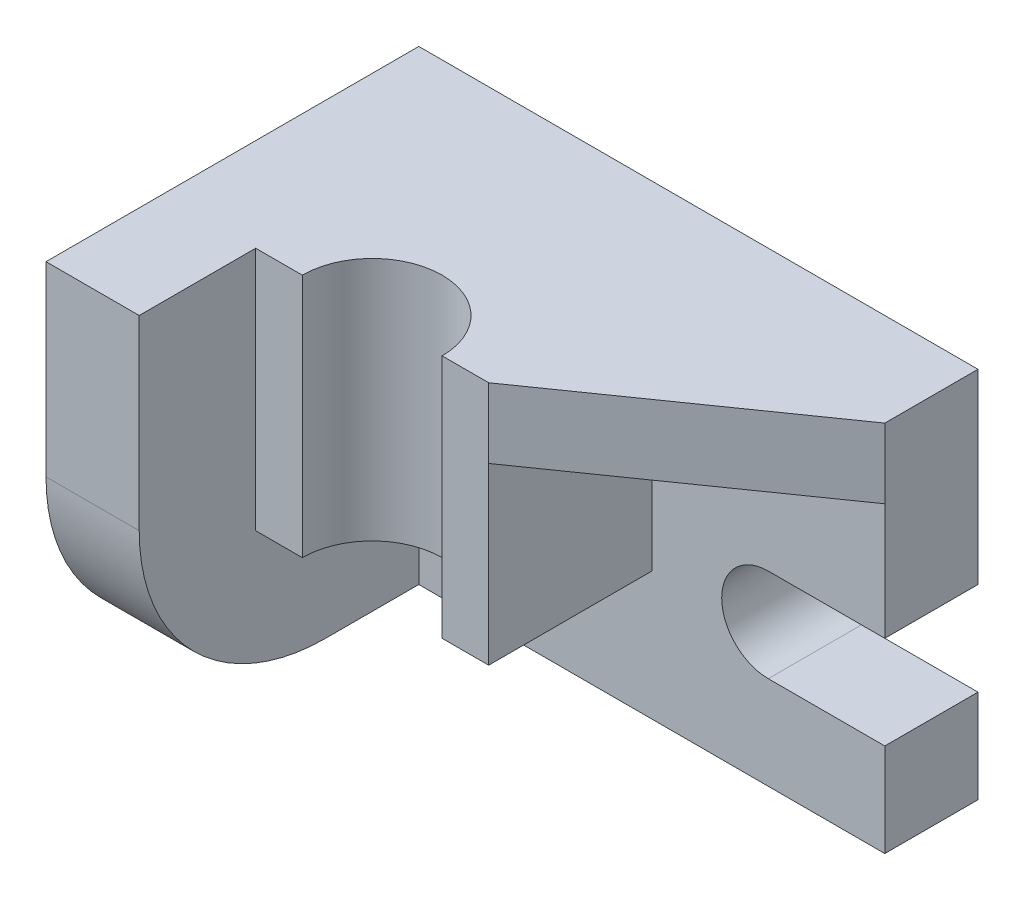
ISO-10303-21;
HEADER;
FILE_DESCRIPTION(('STEP AP214'),'2;1');
FILE_NAME('part.step','',(''),(''),'','','');
FILE_SCHEMA(('AUTOMOTIVE_DESIGN { 1 0 10303 214 1 1 1 1 }'));
ENDSEC;
DATA;
#1=APPLICATION_CONTEXT('core data for automotive mechanical design processes');
#2=APPLICATION_PROTOCOL_DEFINITION('international standard','automotive_design',2000,#1);
#3=PRODUCT_CONTEXT('',#1,'mechanical');
#4=PRODUCT('Part','Part','',(#3));
#5=PRODUCT_RELATED_PRODUCT_CATEGORY('part','',(#4));
#6=PRODUCT_DEFINITION_FORMATION('','',#4);
#7=PRODUCT_DEFINITION_CONTEXT('part definition',#1,'design');
#8=PRODUCT_DEFINITION('design','',#6,#7);
#9=PRODUCT_DEFINITION_SHAPE('','',#8);
#10=(LENGTH_UNIT() NAMED_UNIT(*) SI_UNIT(.MILLI.,.METRE.));
#11=(NAMED_UNIT(*) PLANE_ANGLE_UNIT() SI_UNIT($,.RADIAN.));
#12=(NAMED_UNIT(*) SI_UNIT($,.STERADIAN.) SOLID_ANGLE_UNIT());
#13=UNCERTAINTY_MEASURE_WITH_UNIT(LENGTH_MEASURE(1.E-05),#10,'distance_accuracy_value','');
#14=(GEOMETRIC_REPRESENTATION_CONTEXT(3) GLOBAL_UNCERTAINTY_ASSIGNED_CONTEXT((#13)) GLOBAL_UNIT_ASSIGNED_CONTEXT((#10,
#11,#12)) REPRESENTATION_CONTEXT('',''));
#15=CARTESIAN_POINT('',(0.,0.,0.));
#16=DIRECTION('',(0.,0.,1.));
#17=DIRECTION('',(1.,0.,0.));
#18=AXIS2_PLACEMENT_3D('',#15,#16,#17);
#19=CARTESIAN_POINT('',(96.,0.,16.));
#20=DIRECTION('',(-1.,0.,0.));
#21=DIRECTION('',(0.,0.,1.));
#22=AXIS2_PLACEMENT_3D('',#19,#20,#21);
#23=PLANE('',#22);
#24=DIRECTION('',(0.,1.,0.));
#25=VECTOR('',#24,1.);
#26=CARTESIAN_POINT('',(96.,0.,0.));
#27=LINE('',#26,#25);
#28=CARTESIAN_POINT('',(96.,0.,0.));
#29=VERTEX_POINT('',#28);
#30=CARTESIAN_POINT('',(96.,16.,0.));
#31=VERTEX_POINT('',#30);
#32=EDGE_CURVE('E172',#29,#31,#27,.T.);
#33=ORIENTED_EDGE('',*,*,#32,.T.);
#34=DIRECTION('',(0.,0.,1.));
#35=VECTOR('',#34,1.);
#36=CARTESIAN_POINT('',(96.,16.,0.));
#37=LINE('',#36,#35);
#38=CARTESIAN_POINT('',(96.,16.,16.));
#39=VERTEX_POINT('',#38);
#40=EDGE_CURVE('E157',#31,#39,#37,.T.);
#41=ORIENTED_EDGE('',*,*,#40,.T.);
#42=DIRECTION('',(0.,1.,0.));
#43=VECTOR('',#42,1.);
#44=CARTESIAN_POINT('',(96.,0.,16.));
#45=LINE('',#44,#43);
#46=CARTESIAN_POINT('',(96.,0.,16.));
#47=VERTEX_POINT('',#46);
#48=EDGE_CURVE('E192',#47,#39,#45,.T.);
#49=ORIENTED_EDGE('',*,*,#48,.F.);
#50=DIRECTION('',(0.,0.,-1.));
#51=VECTOR('',#50,1.);
#52=CARTESIAN_POINT('',(96.,0.,16.));
#53=LINE('',#52,#51);
#54=EDGE_CURVE('E45',#47,#29,#53,.T.);
#55=ORIENTED_EDGE('',*,*,#54,.T.);
#56=EDGE_LOOP('',(#33,#41,#49,#55));
#57=FACE_BOUND('',#56,.T.);
#58=ADVANCED_FACE('F37',(#57),#23,.F.);
#59=CARTESIAN_POINT('',(0.,0.,16.));
#60=DIRECTION('',(0.,0.,1.));
#61=DIRECTION('',(1.,0.,0.));
#62=AXIS2_PLACEMENT_3D('',#59,#60,#61);
#63=PLANE('',#62);
#64=DIRECTION('',(1.,0.,0.));
#65=VECTOR('',#64,1.);
#66=CARTESIAN_POINT('',(96.,16.,16.));
#67=LINE('',#66,#65);
#68=CARTESIAN_POINT('',(76.,16.,16.));
#69=VERTEX_POINT('',#68);
#70=EDGE_CURVE('E162',#69,#39,#67,.T.);
#71=ORIENTED_EDGE('',*,*,#70,.F.);
#72=CARTESIAN_POINT('',(76.,24.,16.));
#73=DIRECTION('',(0.,0.,1.));
#74=DIRECTION('',(1.,0.,0.));
#75=AXIS2_PLACEMENT_3D('',#72,#73,#74);
#76=CIRCLE('',#75,8.);
#77=CARTESIAN_POINT('',(76.,32.,16.));
#78=VERTEX_POINT('',#77);
#79=EDGE_CURVE('E175',#78,#69,#76,.T.);
#80=ORIENTED_EDGE('',*,*,#79,.F.);
#81=DIRECTION('',(-1.,0.,0.));
#82=VECTOR('',#81,1.);
#83=CARTESIAN_POINT('',(96.,32.,16.));
#84=LINE('',#83,#82);
#85=CARTESIAN_POINT('',(96.,32.,16.));
#86=VERTEX_POINT('',#85);
#87=EDGE_CURVE('E297',#86,#78,#84,.T.);
#88=ORIENTED_EDGE('',*,*,#87,.F.);
#89=CARTESIAN_POINT('',(96.,52.,16.));
#90=VERTEX_POINT('',#89);
#91=EDGE_CURVE('E214',#86,#90,#45,.T.);
#92=ORIENTED_EDGE('',*,*,#91,.T.);
#93=DIRECTION('',(-1.,0.,0.));
#94=VECTOR('',#93,1.);
#95=CARTESIAN_POINT('',(96.,52.,16.));
#96=LINE('',#95,#94);
#97=CARTESIAN_POINT('',(56.,52.,16.));
#98=VERTEX_POINT('',#97);
#99=EDGE_CURVE('E286',#90,#98,#96,.T.);
#100=ORIENTED_EDGE('',*,*,#99,.T.);
#101=DIRECTION('',(0.,1.,0.));
#102=VECTOR('',#101,1.);
#103=CARTESIAN_POINT('',(56.,22.,16.));
#104=LINE('',#103,#102);
#105=CARTESIAN_POINT('',(56.,22.,16.));
#106=VERTEX_POINT('',#105);
#107=EDGE_CURVE('E234',#106,#98,#104,.T.);
#108=ORIENTED_EDGE('',*,*,#107,.F.);
#109=DIRECTION('',(-1.,0.,0.));
#110=VECTOR('',#109,1.);
#111=CARTESIAN_POINT('',(16.,22.,16.));
#112=LINE('',#111,#110);
#113=CARTESIAN_POINT('',(16.,22.,16.));
#114=VERTEX_POINT('',#113);
#115=EDGE_CURVE('E243',#106,#114,#112,.T.);
#116=ORIENTED_EDGE('',*,*,#115,.T.);
#117=DIRECTION('',(0.,-1.,0.));
#118=VECTOR('',#117,1.);
#119=CARTESIAN_POINT('',(16.,0.,16.));
#120=LINE('',#119,#118);
#121=CARTESIAN_POINT('',(16.,0.,16.));
#122=VERTEX_POINT('',#121);
#123=EDGE_CURVE('E60',#114,#122,#120,.T.);
#124=ORIENTED_EDGE('',*,*,#123,.T.);
#125=DIRECTION('',(1.,0.,0.));
#126=VECTOR('',#125,1.);
#127=CARTESIAN_POINT('',(0.,0.,16.));
#128=LINE('',#127,#126);
#129=EDGE_CURVE('E182',#122,#47,#128,.T.);
#130=ORIENTED_EDGE('',*,*,#129,.T.);
#131=ORIENTED_EDGE('',*,*,#48,.T.);
#132=EDGE_LOOP('',(#71,#80,#88,#92,#100,#108,#116,#124,#130,#131));
#133=FACE_BOUND('',#132,.T.);
#134=ADVANCED_FACE('F309',(#133),#63,.T.);
#135=CARTESIAN_POINT('',(0.,64.,16.));
#136=DIRECTION('',(1.,0.,0.));
#137=DIRECTION('',(0.,0.,-1.));
#138=AXIS2_PLACEMENT_3D('',#135,#136,#137);
#139=PLANE('',#138);
#140=DIRECTION('',(0.,-1.,0.));
#141=VECTOR('',#140,1.);
#142=CARTESIAN_POINT('',(0.,64.,0.));
#143=LINE('',#142,#141);
#144=CARTESIAN_POINT('',(0.,64.,0.));
#145=VERTEX_POINT('',#144);
#146=CARTESIAN_POINT('',(0.,0.,0.));
#147=VERTEX_POINT('',#146);
#148=EDGE_CURVE('E206',#145,#147,#143,.T.);
#149=ORIENTED_EDGE('',*,*,#148,.T.);
#150=DIRECTION('',(0.,0.,-1.));
#151=VECTOR('',#150,1.);
#152=CARTESIAN_POINT('',(0.,0.,16.));
#153=LINE('',#152,#151);
#154=CARTESIAN_POINT('',(0.,0.,31.9999999999998));
#155=VERTEX_POINT('',#154);
#156=EDGE_CURVE('E11',#155,#147,#153,.T.);
#157=ORIENTED_EDGE('',*,*,#156,.F.);
#158=CARTESIAN_POINT('',(0.,32.,32.));
#159=DIRECTION('',(-1.,0.,0.));
#160=DIRECTION('',(0.,0.,-1.));
#161=AXIS2_PLACEMENT_3D('',#158,#159,#160);
#162=CIRCLE('',#161,32.);
#163=CARTESIAN_POINT('',(0.,32.0000000000002,64.));
#164=VERTEX_POINT('',#163);
#165=EDGE_CURVE('E224',#155,#164,#162,.T.);
#166=ORIENTED_EDGE('',*,*,#165,.T.);
#167=DIRECTION('',(0.,1.,0.));
#168=VECTOR('',#167,1.);
#169=CARTESIAN_POINT('',(0.,64.,64.));
#170=LINE('',#169,#168);
#171=CARTESIAN_POINT('',(0.,64.,64.));
#172=VERTEX_POINT('',#171);
#173=EDGE_CURVE('E221',#164,#172,#170,.T.);
#174=ORIENTED_EDGE('',*,*,#173,.T.);
#175=DIRECTION('',(0.,0.,-1.));
#176=VECTOR('',#175,1.);
#177=CARTESIAN_POINT('',(0.,64.,16.));
#178=LINE('',#177,#176);
#179=EDGE_CURVE('E188',#172,#145,#178,.T.);
#180=ORIENTED_EDGE('',*,*,#179,.T.);
#181=EDGE_LOOP('',(#149,#157,#166,#174,#180));
#182=FACE_BOUND('',#181,.T.);
#183=ADVANCED_FACE('F39',(#182),#139,.F.);
#184=CARTESIAN_POINT('',(0.,0.,16.));
#185=DIRECTION('',(0.,1.,0.));
#186=DIRECTION('',(0.,0.,1.));
#187=AXIS2_PLACEMENT_3D('',#184,#185,#186);
#188=PLANE('',#187);
#189=DIRECTION('',(1.,0.,0.));
#190=VECTOR('',#189,1.);
#191=CARTESIAN_POINT('',(0.,0.,0.));
#192=LINE('',#191,#190);
#193=EDGE_CURVE('E184',#147,#29,#192,.T.);
#194=ORIENTED_EDGE('',*,*,#193,.T.);
#195=ORIENTED_EDGE('',*,*,#54,.F.);
#196=ORIENTED_EDGE('',*,*,#129,.F.);
#197=DIRECTION('',(0.,0.,1.));
#198=VECTOR('',#197,1.);
#199=CARTESIAN_POINT('',(16.,0.,31.9999999999998));
#200=LINE('',#199,#198);
#201=CARTESIAN_POINT('',(16.,0.,31.9999999999998));
#202=VERTEX_POINT('',#201);
#203=EDGE_CURVE('E222',#122,#202,#200,.T.);
#204=ORIENTED_EDGE('',*,*,#203,.T.);
#205=DIRECTION('',(1.,0.,0.));
#206=VECTOR('',#205,1.);
#207=CARTESIAN_POINT('',(0.,0.,31.9999999999998));
#208=LINE('',#207,#206);
#209=EDGE_CURVE('E218',#155,#202,#208,.T.);
#210=ORIENTED_EDGE('',*,*,#209,.F.);
#211=ORIENTED_EDGE('',*,*,#156,.T.);
#212=EDGE_LOOP('',(#194,#195,#196,#204,#210,#211));
#213=FACE_BOUND('',#212,.T.);
#214=ADVANCED_FACE('F338',(#213),#188,.F.);
#215=ORIENTED_EDGE('',*,*,#91,.F.);
#216=DIRECTION('',(0.,0.,1.));
#217=VECTOR('',#216,1.);
#218=CARTESIAN_POINT('',(96.,32.,0.));
#219=LINE('',#218,#217);
#220=CARTESIAN_POINT('',(96.,32.,0.));
#221=VERTEX_POINT('',#220);
#222=EDGE_CURVE('E167',#221,#86,#219,.T.);
#223=ORIENTED_EDGE('',*,*,#222,.F.);
#224=CARTESIAN_POINT('',(96.,64.,0.));
#225=VERTEX_POINT('',#224);
#226=EDGE_CURVE('E180',#221,#225,#27,.T.);
#227=ORIENTED_EDGE('',*,*,#226,.T.);
#228=DIRECTION('',(0.,0.,-1.));
#229=VECTOR('',#228,1.);
#230=CARTESIAN_POINT('',(96.,64.,16.));
#231=LINE('',#230,#229);
#232=CARTESIAN_POINT('',(96.,64.,16.));
#233=VERTEX_POINT('',#232);
#234=EDGE_CURVE('E191',#233,#225,#231,.T.);
#235=ORIENTED_EDGE('',*,*,#234,.F.);
#236=DIRECTION('',(0.,1.,0.));
#237=VECTOR('',#236,1.);
#238=CARTESIAN_POINT('',(96.,52.,16.));
#239=LINE('',#238,#237);
#240=EDGE_CURVE('E276',#90,#233,#239,.T.);
#241=ORIENTED_EDGE('',*,*,#240,.F.);
#242=EDGE_LOOP('',(#215,#223,#227,#235,#241));
#243=FACE_BOUND('',#242,.T.);
#244=ADVANCED_FACE('F307',(#243),#23,.F.);
#245=CARTESIAN_POINT('',(96.,64.,16.));
#246=DIRECTION('',(0.,-1.,0.));
#247=DIRECTION('',(0.,0.,-1.));
#248=AXIS2_PLACEMENT_3D('',#245,#246,#247);
#249=PLANE('',#248);
#250=DIRECTION('',(-1.,0.,0.));
#251=VECTOR('',#250,1.);
#252=CARTESIAN_POINT('',(96.,64.,0.));
#253=LINE('',#252,#251);
#254=EDGE_CURVE('E179',#225,#145,#253,.T.);
#255=ORIENTED_EDGE('',*,*,#254,.T.);
#256=ORIENTED_EDGE('',*,*,#179,.F.);
#257=DIRECTION('',(1.,0.,0.));
#258=VECTOR('',#257,1.);
#259=CARTESIAN_POINT('',(0.,64.,64.));
#260=LINE('',#259,#258);
#261=CARTESIAN_POINT('',(16.,64.,64.));
#262=VERTEX_POINT('',#261);
#263=EDGE_CURVE('E210',#172,#262,#260,.T.);
#264=ORIENTED_EDGE('',*,*,#263,.T.);
#265=DIRECTION('',(0.,0.,-1.));
#266=VECTOR('',#265,1.);
#267=CARTESIAN_POINT('',(16.,64.,16.));
#268=LINE('',#267,#266);
#269=CARTESIAN_POINT('',(16.,64.,44.));
#270=VERTEX_POINT('',#269);
#271=EDGE_CURVE('E226',#262,#270,#268,.T.);
#272=ORIENTED_EDGE('',*,*,#271,.T.);
#273=DIRECTION('',(1.,0.,0.));
#274=VECTOR('',#273,1.);
#275=CARTESIAN_POINT('',(16.,64.,44.));
#276=LINE('',#275,#274);
#277=CARTESIAN_POINT('',(24.,64.,44.));
#278=VERTEX_POINT('',#277);
#279=EDGE_CURVE('E258',#270,#278,#276,.T.);
#280=ORIENTED_EDGE('',*,*,#279,.T.);
#281=CARTESIAN_POINT('',(36.,64.,44.));
#282=DIRECTION('',(0.,-1.,0.));
#283=DIRECTION('',(0.,0.,1.));
#284=AXIS2_PLACEMENT_3D('',#281,#282,#283);
#285=CIRCLE('',#284,12.);
#286=CARTESIAN_POINT('',(48.,64.,44.));
#287=VERTEX_POINT('',#286);
#288=EDGE_CURVE('E255',#278,#287,#285,.T.);
#289=ORIENTED_EDGE('',*,*,#288,.T.);
#290=DIRECTION('',(1.,0.,0.));
#291=VECTOR('',#290,1.);
#292=CARTESIAN_POINT('',(56.,64.,44.));
#293=LINE('',#292,#291);
#294=CARTESIAN_POINT('',(56.,64.,44.));
#295=VERTEX_POINT('',#294);
#296=EDGE_CURVE('E252',#287,#295,#293,.T.);
#297=ORIENTED_EDGE('',*,*,#296,.T.);
#298=DIRECTION('',(0.819231920519041,0.,-0.573462344363328));
#299=VECTOR('',#298,1.);
#300=CARTESIAN_POINT('',(56.,64.,44.));
#301=LINE('',#300,#299);
#302=EDGE_CURVE('E200',#295,#233,#301,.T.);
#303=ORIENTED_EDGE('',*,*,#302,.T.);
#304=ORIENTED_EDGE('',*,*,#234,.T.);
#305=EDGE_LOOP('',(#255,#256,#264,#272,#280,#289,#297,#303,#304));
#306=FACE_BOUND('',#305,.T.);
#307=ADVANCED_FACE('F198',(#306),#249,.F.);
#308=CARTESIAN_POINT('',(0.,0.,0.));
#309=DIRECTION('',(0.,0.,1.));
#310=DIRECTION('',(1.,0.,0.));
#311=AXIS2_PLACEMENT_3D('',#308,#309,#310);
#312=PLANE('',#311);
#313=CARTESIAN_POINT('',(76.,24.,0.));
#314=DIRECTION('',(0.,0.,1.));
#315=DIRECTION('',(1.,0.,0.));
#316=AXIS2_PLACEMENT_3D('',#313,#314,#315);
#317=CIRCLE('',#316,8.);
#318=CARTESIAN_POINT('',(76.,32.,0.));
#319=VERTEX_POINT('',#318);
#320=CARTESIAN_POINT('',(76.,16.,0.));
#321=VERTEX_POINT('',#320);
#322=EDGE_CURVE('E52',#319,#321,#317,.T.);
#323=ORIENTED_EDGE('',*,*,#322,.T.);
#324=DIRECTION('',(1.,0.,0.));
#325=VECTOR('',#324,1.);
#326=CARTESIAN_POINT('',(96.,16.,0.));
#327=LINE('',#326,#325);
#328=EDGE_CURVE('E160',#321,#31,#327,.T.);
#329=ORIENTED_EDGE('',*,*,#328,.T.);
#330=ORIENTED_EDGE('',*,*,#32,.F.);
#331=ORIENTED_EDGE('',*,*,#193,.F.);
#332=ORIENTED_EDGE('',*,*,#148,.F.);
#333=ORIENTED_EDGE('',*,*,#254,.F.);
#334=ORIENTED_EDGE('',*,*,#226,.F.);
#335=DIRECTION('',(-1.,0.,0.));
#336=VECTOR('',#335,1.);
#337=CARTESIAN_POINT('',(96.,32.,0.));
#338=LINE('',#337,#336);
#339=EDGE_CURVE('E174',#221,#319,#338,.T.);
#340=ORIENTED_EDGE('',*,*,#339,.T.);
#341=EDGE_LOOP('',(#323,#329,#330,#331,#332,#333,#334,#340));
#342=FACE_BOUND('',#341,.T.);
#343=ADVANCED_FACE('F171',(#342),#312,.F.);
#344=CARTESIAN_POINT('',(0.,32.,32.));
#345=DIRECTION('',(1.,0.,0.));
#346=DIRECTION('',(0.,0.,-1.));
#347=AXIS2_PLACEMENT_3D('',#344,#345,#346);
#348=CYLINDRICAL_SURFACE('',#347,32.);
#349=CARTESIAN_POINT('',(16.,32.,32.));
#350=DIRECTION('',(-1.,0.,0.));
#351=DIRECTION('',(0.,0.,-1.));
#352=AXIS2_PLACEMENT_3D('',#349,#350,#351);
#353=CIRCLE('',#352,32.);
#354=CARTESIAN_POINT('',(16.,32.0000000000002,64.));
#355=VERTEX_POINT('',#354);
#356=EDGE_CURVE('E231',#202,#355,#353,.T.);
#357=ORIENTED_EDGE('',*,*,#356,.T.);
#358=DIRECTION('',(1.,0.,0.));
#359=VECTOR('',#358,1.);
#360=CARTESIAN_POINT('',(0.,32.0000000000002,64.));
#361=LINE('',#360,#359);
#362=EDGE_CURVE('E208',#164,#355,#361,.T.);
#363=ORIENTED_EDGE('',*,*,#362,.F.);
#364=ORIENTED_EDGE('',*,*,#165,.F.);
#365=ORIENTED_EDGE('',*,*,#209,.T.);
#366=EDGE_LOOP('',(#357,#363,#364,#365));
#367=FACE_BOUND('',#366,.T.);
#368=ADVANCED_FACE('F387',(#367),#348,.T.);
#369=CARTESIAN_POINT('',(0.,64.,64.));
#370=DIRECTION('',(0.,0.,-1.));
#371=DIRECTION('',(-1.,0.,0.));
#372=AXIS2_PLACEMENT_3D('',#369,#370,#371);
#373=PLANE('',#372);
#374=DIRECTION('',(0.,1.,0.));
#375=VECTOR('',#374,1.);
#376=CARTESIAN_POINT('',(16.,64.,64.));
#377=LINE('',#376,#375);
#378=EDGE_CURVE('E229',#355,#262,#377,.T.);
#379=ORIENTED_EDGE('',*,*,#378,.T.);
#380=ORIENTED_EDGE('',*,*,#263,.F.);
#381=ORIENTED_EDGE('',*,*,#173,.F.);
#382=ORIENTED_EDGE('',*,*,#362,.T.);
#383=EDGE_LOOP('',(#379,#380,#381,#382));
#384=FACE_BOUND('',#383,.T.);
#385=ADVANCED_FACE('F456',(#384),#373,.F.);
#386=CARTESIAN_POINT('',(16.,32.,32.));
#387=DIRECTION('',(1.,0.,0.));
#388=DIRECTION('',(0.,0.,-1.));
#389=AXIS2_PLACEMENT_3D('',#386,#387,#388);
#390=PLANE('',#389);
#391=DIRECTION('',(0.,1.,0.));
#392=VECTOR('',#391,1.);
#393=CARTESIAN_POINT('',(16.,22.,44.));
#394=LINE('',#393,#392);
#395=CARTESIAN_POINT('',(16.,22.,44.));
#396=VERTEX_POINT('',#395);
#397=EDGE_CURVE('E239',#396,#270,#394,.T.);
#398=ORIENTED_EDGE('',*,*,#397,.T.);
#399=ORIENTED_EDGE('',*,*,#271,.F.);
#400=ORIENTED_EDGE('',*,*,#378,.F.);
#401=ORIENTED_EDGE('',*,*,#356,.F.);
#402=ORIENTED_EDGE('',*,*,#203,.F.);
#403=ORIENTED_EDGE('',*,*,#123,.F.);
#404=DIRECTION('',(0.,0.,1.));
#405=VECTOR('',#404,1.);
#406=CARTESIAN_POINT('',(16.,22.,16.));
#407=LINE('',#406,#405);
#408=EDGE_CURVE('E254',#114,#396,#407,.T.);
#409=ORIENTED_EDGE('',*,*,#408,.T.);
#410=EDGE_LOOP('',(#398,#399,#400,#401,#402,#403,#409));
#411=FACE_BOUND('',#410,.T.);
#412=ADVANCED_FACE('F333',(#411),#390,.T.);
#413=CARTESIAN_POINT('',(56.,22.,16.));
#414=DIRECTION('',(1.,0.,0.));
#415=DIRECTION('',(0.,0.,-1.));
#416=AXIS2_PLACEMENT_3D('',#413,#414,#415);
#417=PLANE('',#416);
#418=DIRECTION('',(0.,0.,1.));
#419=VECTOR('',#418,1.);
#420=CARTESIAN_POINT('',(56.,52.,16.));
#421=LINE('',#420,#419);
#422=CARTESIAN_POINT('',(56.,52.,44.));
#423=VERTEX_POINT('',#422);
#424=EDGE_CURVE('E278',#98,#423,#421,.T.);
#425=ORIENTED_EDGE('',*,*,#424,.T.);
#426=DIRECTION('',(0.,1.,0.));
#427=VECTOR('',#426,1.);
#428=CARTESIAN_POINT('',(56.,22.,44.));
#429=LINE('',#428,#427);
#430=CARTESIAN_POINT('',(56.,22.,44.));
#431=VERTEX_POINT('',#430);
#432=EDGE_CURVE('E247',#431,#423,#429,.T.);
#433=ORIENTED_EDGE('',*,*,#432,.F.);
#434=DIRECTION('',(0.,0.,-1.));
#435=VECTOR('',#434,1.);
#436=CARTESIAN_POINT('',(56.,22.,16.));
#437=LINE('',#436,#435);
#438=EDGE_CURVE('E263',#431,#106,#437,.T.);
#439=ORIENTED_EDGE('',*,*,#438,.T.);
#440=ORIENTED_EDGE('',*,*,#107,.T.);
#441=EDGE_LOOP('',(#425,#433,#439,#440));
#442=FACE_BOUND('',#441,.T.);
#443=ADVANCED_FACE('F331',(#442),#417,.T.);
#444=CARTESIAN_POINT('',(56.,22.,44.));
#445=DIRECTION('',(0.,0.,1.));
#446=DIRECTION('',(1.,0.,0.));
#447=AXIS2_PLACEMENT_3D('',#444,#445,#446);
#448=PLANE('',#447);
#449=ORIENTED_EDGE('',*,*,#296,.F.);
#450=DIRECTION('',(0.,1.,0.));
#451=VECTOR('',#450,1.);
#452=CARTESIAN_POINT('',(48.,22.,44.));
#453=LINE('',#452,#451);
#454=CARTESIAN_POINT('',(48.,22.,44.));
#455=VERTEX_POINT('',#454);
#456=EDGE_CURVE('E245',#455,#287,#453,.T.);
#457=ORIENTED_EDGE('',*,*,#456,.F.);
#458=DIRECTION('',(1.,0.,0.));
#459=VECTOR('',#458,1.);
#460=CARTESIAN_POINT('',(56.,22.,44.));
#461=LINE('',#460,#459);
#462=EDGE_CURVE('E265',#455,#431,#461,.T.);
#463=ORIENTED_EDGE('',*,*,#462,.T.);
#464=ORIENTED_EDGE('',*,*,#432,.T.);
#465=DIRECTION('',(0.,1.,0.));
#466=VECTOR('',#465,1.);
#467=CARTESIAN_POINT('',(56.,52.,44.));
#468=LINE('',#467,#466);
#469=EDGE_CURVE('E261',#423,#295,#468,.T.);
#470=ORIENTED_EDGE('',*,*,#469,.T.);
#471=EDGE_LOOP('',(#449,#457,#463,#464,#470));
#472=FACE_BOUND('',#471,.T.);
#473=ADVANCED_FACE('F319',(#472),#448,.T.);
#474=CARTESIAN_POINT('',(36.,22.,44.));
#475=DIRECTION('',(0.,1.,0.));
#476=DIRECTION('',(0.,0.,1.));
#477=AXIS2_PLACEMENT_3D('',#474,#475,#476);
#478=CYLINDRICAL_SURFACE('',#477,12.);
#479=ORIENTED_EDGE('',*,*,#288,.F.);
#480=DIRECTION('',(0.,1.,0.));
#481=VECTOR('',#480,1.);
#482=CARTESIAN_POINT('',(24.,22.,44.));
#483=LINE('',#482,#481);
#484=CARTESIAN_POINT('',(24.,22.,44.));
#485=VERTEX_POINT('',#484);
#486=EDGE_CURVE('E242',#485,#278,#483,.T.);
#487=ORIENTED_EDGE('',*,*,#486,.F.);
#488=CARTESIAN_POINT('',(36.,22.,44.));
#489=DIRECTION('',(0.,-1.,0.));
#490=DIRECTION('',(0.,0.,1.));
#491=AXIS2_PLACEMENT_3D('',#488,#489,#490);
#492=CIRCLE('',#491,12.);
#493=EDGE_CURVE('E268',#485,#455,#492,.T.);
#494=ORIENTED_EDGE('',*,*,#493,.T.);
#495=ORIENTED_EDGE('',*,*,#456,.T.);
#496=EDGE_LOOP('',(#479,#487,#494,#495));
#497=FACE_BOUND('',#496,.T.);
#498=ADVANCED_FACE('F322',(#497),#478,.F.);
#499=CARTESIAN_POINT('',(16.,22.,44.));
#500=DIRECTION('',(0.,0.,1.));
#501=DIRECTION('',(1.,0.,0.));
#502=AXIS2_PLACEMENT_3D('',#499,#500,#501);
#503=PLANE('',#502);
#504=ORIENTED_EDGE('',*,*,#279,.F.);
#505=ORIENTED_EDGE('',*,*,#397,.F.);
#506=DIRECTION('',(1.,0.,0.));
#507=VECTOR('',#506,1.);
#508=CARTESIAN_POINT('',(16.,22.,44.));
#509=LINE('',#508,#507);
#510=EDGE_CURVE('E271',#396,#485,#509,.T.);
#511=ORIENTED_EDGE('',*,*,#510,.T.);
#512=ORIENTED_EDGE('',*,*,#486,.T.);
#513=EDGE_LOOP('',(#504,#505,#511,#512));
#514=FACE_BOUND('',#513,.T.);
#515=ADVANCED_FACE('F424',(#514),#503,.T.);
#516=CARTESIAN_POINT('',(36.,22.,44.));
#517=DIRECTION('',(0.,1.,0.));
#518=DIRECTION('',(0.,0.,1.));
#519=AXIS2_PLACEMENT_3D('',#516,#517,#518);
#520=PLANE('',#519);
#521=ORIENTED_EDGE('',*,*,#408,.F.);
#522=ORIENTED_EDGE('',*,*,#115,.F.);
#523=ORIENTED_EDGE('',*,*,#438,.F.);
#524=ORIENTED_EDGE('',*,*,#462,.F.);
#525=ORIENTED_EDGE('',*,*,#493,.F.);
#526=ORIENTED_EDGE('',*,*,#510,.F.);
#527=EDGE_LOOP('',(#521,#522,#523,#524,#525,#526));
#528=FACE_BOUND('',#527,.T.);
#529=ADVANCED_FACE('F327',(#528),#520,.F.);
#530=CARTESIAN_POINT('',(56.,52.,44.));
#531=DIRECTION('',(0.573462344363328,0.,0.81923192051904));
#532=DIRECTION('',(0.819231920519041,0.,-0.573462344363328));
#533=AXIS2_PLACEMENT_3D('',#530,#531,#532);
#534=PLANE('',#533);
#535=ORIENTED_EDGE('',*,*,#302,.F.);
#536=ORIENTED_EDGE('',*,*,#469,.F.);
#537=DIRECTION('',(0.819231920519041,0.,-0.573462344363328));
#538=VECTOR('',#537,1.);
#539=CARTESIAN_POINT('',(56.,52.,44.));
#540=LINE('',#539,#538);
#541=EDGE_CURVE('E282',#423,#90,#540,.T.);
#542=ORIENTED_EDGE('',*,*,#541,.T.);
#543=ORIENTED_EDGE('',*,*,#240,.T.);
#544=EDGE_LOOP('',(#535,#536,#542,#543));
#545=FACE_BOUND('',#544,.T.);
#546=ADVANCED_FACE('F316',(#545),#534,.T.);
#547=CARTESIAN_POINT('',(0.,52.,0.));
#548=DIRECTION('',(0.,-1.,0.));
#549=DIRECTION('',(0.,0.,-1.));
#550=AXIS2_PLACEMENT_3D('',#547,#548,#549);
#551=PLANE('',#550);
#552=ORIENTED_EDGE('',*,*,#541,.F.);
#553=ORIENTED_EDGE('',*,*,#424,.F.);
#554=ORIENTED_EDGE('',*,*,#99,.F.);
#555=EDGE_LOOP('',(#552,#553,#554));
#556=FACE_BOUND('',#555,.T.);
#557=ADVANCED_FACE('F314',(#556),#551,.T.);
#558=CARTESIAN_POINT('',(96.,16.,0.));
#559=DIRECTION('',(0.,-1.,0.));
#560=DIRECTION('',(0.,0.,-1.));
#561=AXIS2_PLACEMENT_3D('',#558,#559,#560);
#562=PLANE('',#561);
#563=ORIENTED_EDGE('',*,*,#70,.T.);
#564=ORIENTED_EDGE('',*,*,#40,.F.);
#565=ORIENTED_EDGE('',*,*,#328,.F.);
#566=DIRECTION('',(0.,0.,1.));
#567=VECTOR('',#566,1.);
#568=CARTESIAN_POINT('',(76.,16.,0.));
#569=LINE('',#568,#567);
#570=EDGE_CURVE('E283',#321,#69,#569,.T.);
#571=ORIENTED_EDGE('',*,*,#570,.T.);
#572=EDGE_LOOP('',(#563,#564,#565,#571));
#573=FACE_BOUND('',#572,.T.);
#574=ADVANCED_FACE('F159',(#573),#562,.F.);
#575=CARTESIAN_POINT('',(76.,24.,0.));
#576=DIRECTION('',(0.,0.,1.));
#577=DIRECTION('',(1.,0.,0.));
#578=AXIS2_PLACEMENT_3D('',#575,#576,#577);
#579=CYLINDRICAL_SURFACE('',#578,8.);
#580=ORIENTED_EDGE('',*,*,#79,.T.);
#581=ORIENTED_EDGE('',*,*,#570,.F.);
#582=ORIENTED_EDGE('',*,*,#322,.F.);
#583=DIRECTION('',(0.,0.,1.));
#584=VECTOR('',#583,1.);
#585=CARTESIAN_POINT('',(76.,32.,0.));
#586=LINE('',#585,#584);
#587=EDGE_CURVE('E292',#319,#78,#586,.T.);
#588=ORIENTED_EDGE('',*,*,#587,.T.);
#589=EDGE_LOOP('',(#580,#581,#582,#588));
#590=FACE_BOUND('',#589,.T.);
#591=ADVANCED_FACE('F339',(#590),#579,.F.);
#592=CARTESIAN_POINT('',(96.,32.,0.));
#593=DIRECTION('',(0.,1.,0.));
#594=DIRECTION('',(0.,0.,1.));
#595=AXIS2_PLACEMENT_3D('',#592,#593,#594);
#596=PLANE('',#595);
#597=ORIENTED_EDGE('',*,*,#87,.T.);
#598=ORIENTED_EDGE('',*,*,#587,.F.);
#599=ORIENTED_EDGE('',*,*,#339,.F.);
#600=ORIENTED_EDGE('',*,*,#222,.T.);
#601=EDGE_LOOP('',(#597,#598,#599,#600));
#602=FACE_BOUND('',#601,.T.);
#603=ADVANCED_FACE('F304',(#602),#596,.F.);
#604=CLOSED_SHELL('',(#58,#134,#183,#214,#244,#307,#343,#368,#385,#412,#443,#473,#498,#515,#529,
#546,#557,#574,#591,#603));
#605=MANIFOLD_SOLID_BREP('B2',#604);
#606=ADVANCED_BREP_SHAPE_REPRESENTATION('',(#18,#605),#14);
#607=SHAPE_DEFINITION_REPRESENTATION(#9,#606);
ENDSEC;
END-ISO-10303-21;
